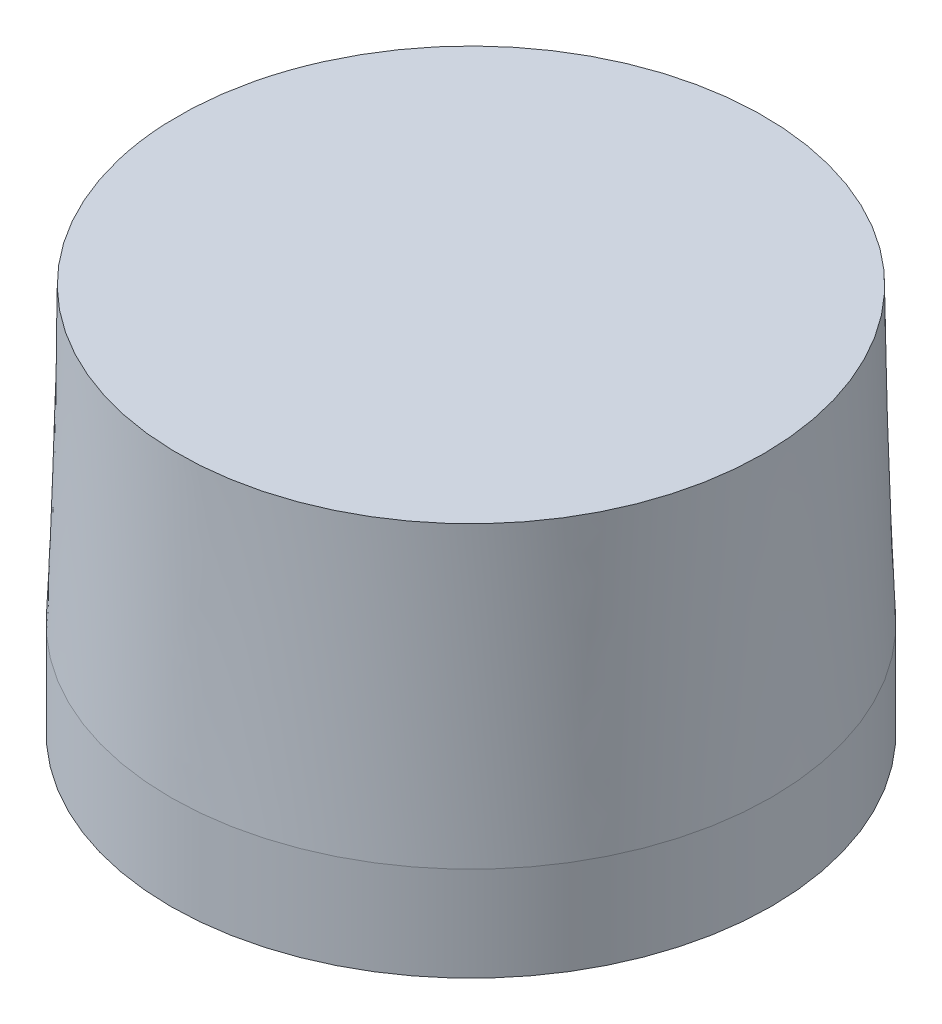
ISO-10303-21;
HEADER;
FILE_DESCRIPTION(('STEP AP214'),'2;1');
FILE_NAME('part.step','',(''),(''),'','','');
FILE_SCHEMA(('AUTOMOTIVE_DESIGN { 1 0 10303 214 1 1 1 1 }'));
ENDSEC;
DATA;
#1=APPLICATION_CONTEXT('core data for automotive mechanical design processes');
#2=APPLICATION_PROTOCOL_DEFINITION('international standard','automotive_design',2000,#1);
#3=PRODUCT_CONTEXT('',#1,'mechanical');
#4=PRODUCT('Part','Part','',(#3));
#5=PRODUCT_RELATED_PRODUCT_CATEGORY('part','',(#4));
#6=PRODUCT_DEFINITION_FORMATION('','',#4);
#7=PRODUCT_DEFINITION_CONTEXT('part definition',#1,'design');
#8=PRODUCT_DEFINITION('design','',#6,#7);
#9=PRODUCT_DEFINITION_SHAPE('','',#8);
#10=(LENGTH_UNIT() NAMED_UNIT(*) SI_UNIT(.MILLI.,.METRE.));
#11=(NAMED_UNIT(*) PLANE_ANGLE_UNIT() SI_UNIT($,.RADIAN.));
#12=(NAMED_UNIT(*) SI_UNIT($,.STERADIAN.) SOLID_ANGLE_UNIT());
#13=UNCERTAINTY_MEASURE_WITH_UNIT(LENGTH_MEASURE(1.E-05),#10,'distance_accuracy_value','');
#14=(GEOMETRIC_REPRESENTATION_CONTEXT(3) GLOBAL_UNCERTAINTY_ASSIGNED_CONTEXT((#13)) GLOBAL_UNIT_ASSIGNED_CONTEXT((#10,
#11,#12)) REPRESENTATION_CONTEXT('',''));
#15=CARTESIAN_POINT('',(0.,0.,0.));
#16=DIRECTION('',(0.,0.,1.));
#17=DIRECTION('',(1.,0.,0.));
#18=AXIS2_PLACEMENT_3D('',#15,#16,#17);
#19=CARTESIAN_POINT('',(14.65,4.25,-13.0304146727757));
#20=DIRECTION('',(0.,0.,1.));
#21=DIRECTION('',(1.,0.,0.));
#22=AXIS2_PLACEMENT_3D('',#19,#20,#21);
#23=PLANE('',#22);
#24=DIRECTION('',(-1.,0.,0.));
#25=VECTOR('',#24,1.);
#26=CARTESIAN_POINT('',(15.9,16.6339286852365,-13.0304146727757));
#27=LINE('',#26,#25);
#28=CARTESIAN_POINT('',(14.65,16.6339286852365,-13.0304146727757));
#29=VERTEX_POINT('',#28);
#30=CARTESIAN_POINT('',(13.9,16.6339286852365,-13.0304146727757));
#31=VERTEX_POINT('',#30);
#32=EDGE_CURVE('E150',#29,#31,#27,.T.);
#33=ORIENTED_EDGE('',*,*,#32,.T.);
#34=DIRECTION('',(0.,1.,0.));
#35=VECTOR('',#34,1.);
#36=CARTESIAN_POINT('',(13.9,4.25,-13.0304146727757));
#37=LINE('',#36,#35);
#38=CARTESIAN_POINT('',(13.9,4.25,-13.0304146727757));
#39=VERTEX_POINT('',#38);
#40=EDGE_CURVE('E183',#39,#31,#37,.T.);
#41=ORIENTED_EDGE('',*,*,#40,.F.);
#42=DIRECTION('',(1.,0.,0.));
#43=VECTOR('',#42,1.);
#44=CARTESIAN_POINT('',(14.65,4.25,-13.0304146727757));
#45=LINE('',#44,#43);
#46=CARTESIAN_POINT('',(14.65,4.25,-13.0304146727757));
#47=VERTEX_POINT('',#46);
#48=EDGE_CURVE('E167',#39,#47,#45,.T.);
#49=ORIENTED_EDGE('',*,*,#48,.T.);
#50=DIRECTION('',(0.,1.,0.));
#51=VECTOR('',#50,1.);
#52=CARTESIAN_POINT('',(14.65,4.25,-13.0304146727757));
#53=LINE('',#52,#51);
#54=EDGE_CURVE('E186',#47,#29,#53,.T.);
#55=ORIENTED_EDGE('',*,*,#54,.T.);
#56=EDGE_LOOP('',(#33,#41,#49,#55));
#57=FACE_BOUND('',#56,.T.);
#58=ADVANCED_FACE('F37',(#57),#23,.T.);
#59=CARTESIAN_POINT('',(0.,33.,0.));
#60=DIRECTION('',(0.,-1.,0.));
#61=DIRECTION('',(0.,0.,-1.));
#62=AXIS2_PLACEMENT_3D('',#59,#60,#61);
#63=CYLINDRICAL_SURFACE('',#62,26.9);
#64=DIRECTION('',(0.,1.,0.));
#65=VECTOR('',#64,1.);
#66=CARTESIAN_POINT('',(14.65,4.25,-22.5607513172767));
#67=LINE('',#66,#65);
#68=CARTESIAN_POINT('',(14.65,4.25,-22.5607513172767));
#69=VERTEX_POINT('',#68);
#70=CARTESIAN_POINT('',(14.65,32.25,-22.5607513172767));
#71=VERTEX_POINT('',#70);
#72=EDGE_CURVE('E60',#69,#71,#67,.T.);
#73=ORIENTED_EDGE('',*,*,#72,.F.);
#74=CARTESIAN_POINT('',(0.,4.25,0.));
#75=DIRECTION('',(0.,1.,0.));
#76=DIRECTION('',(0.,0.,1.));
#77=AXIS2_PLACEMENT_3D('',#74,#75,#76);
#78=CIRCLE('',#77,26.9);
#79=CARTESIAN_POINT('',(13.9,4.25,-23.0304146727757));
#80=VERTEX_POINT('',#79);
#81=EDGE_CURVE('E161',#69,#80,#78,.T.);
#82=ORIENTED_EDGE('',*,*,#81,.T.);
#83=DIRECTION('',(0.,1.,0.));
#84=VECTOR('',#83,1.);
#85=CARTESIAN_POINT('',(13.9,4.25,-23.0304146727757));
#86=LINE('',#85,#84);
#87=CARTESIAN_POINT('',(13.9,32.25,-23.0304146727757));
#88=VERTEX_POINT('',#87);
#89=EDGE_CURVE('E173',#80,#88,#86,.T.);
#90=ORIENTED_EDGE('',*,*,#89,.T.);
#91=CARTESIAN_POINT('',(0.,32.25,0.));
#92=DIRECTION('',(0.,-1.,0.));
#93=DIRECTION('',(0.,0.,-1.));
#94=AXIS2_PLACEMENT_3D('',#91,#92,#93);
#95=CIRCLE('',#94,26.9);
#96=CARTESIAN_POINT('',(13.9,32.25,23.0304146727757));
#97=VERTEX_POINT('',#96);
#98=EDGE_CURVE('E218',#97,#88,#95,.T.);
#99=ORIENTED_EDGE('',*,*,#98,.F.);
#100=DIRECTION('',(0.,1.,0.));
#101=VECTOR('',#100,1.);
#102=CARTESIAN_POINT('',(13.9,4.25,23.0304146727757));
#103=LINE('',#102,#101);
#104=CARTESIAN_POINT('',(13.9,4.25,23.0304146727757));
#105=VERTEX_POINT('',#104);
#106=EDGE_CURVE('E215',#105,#97,#103,.T.);
#107=ORIENTED_EDGE('',*,*,#106,.F.);
#108=CARTESIAN_POINT('',(0.,4.25,0.));
#109=DIRECTION('',(0.,-1.,0.));
#110=DIRECTION('',(0.,0.,-1.));
#111=AXIS2_PLACEMENT_3D('',#108,#109,#110);
#112=CIRCLE('',#111,26.9);
#113=CARTESIAN_POINT('',(14.65,4.25,22.5607513172767));
#114=VERTEX_POINT('',#113);
#115=EDGE_CURVE('E191',#114,#105,#112,.T.);
#116=ORIENTED_EDGE('',*,*,#115,.F.);
#117=DIRECTION('',(0.,1.,0.));
#118=VECTOR('',#117,1.);
#119=CARTESIAN_POINT('',(14.65,4.25,22.5607513172767));
#120=LINE('',#119,#118);
#121=CARTESIAN_POINT('',(14.65,32.25,22.5607513172767));
#122=VERTEX_POINT('',#121);
#123=EDGE_CURVE('E201',#114,#122,#120,.T.);
#124=ORIENTED_EDGE('',*,*,#123,.T.);
#125=EDGE_CURVE('E217',#71,#122,#95,.T.);
#126=ORIENTED_EDGE('',*,*,#125,.F.);
#127=EDGE_LOOP('',(#73,#82,#90,#99,#107,#116,#124,#126));
#128=FACE_BOUND('',#127,.T.);
#129=CARTESIAN_POINT('',(0.,0.,0.));
#130=DIRECTION('',(0.,1.,0.));
#131=DIRECTION('',(0.,0.,1.));
#132=AXIS2_PLACEMENT_3D('',#129,#130,#131);
#133=CIRCLE('',#132,26.9);
#134=CARTESIAN_POINT('',(0.,0.,26.9));
#135=VERTEX_POINT('',#134);
#136=EDGE_CURVE('E45',#135,#135,#133,.T.);
#137=ORIENTED_EDGE('',*,*,#136,.F.);
#138=EDGE_LOOP('',(#137));
#139=FACE_BOUND('',#138,.T.);
#140=ADVANCED_FACE('F39',(#128,#139),#63,.F.);
#141=CARTESIAN_POINT('',(0.,32.25,0.));
#142=DIRECTION('',(0.,-1.,0.));
#143=DIRECTION('',(0.,0.,-1.));
#144=AXIS2_PLACEMENT_3D('',#141,#142,#143);
#145=PLANE('',#144);
#146=DIRECTION('',(0.,0.,-1.));
#147=VECTOR('',#146,1.);
#148=CARTESIAN_POINT('',(14.65,32.25,-22.5607513172767));
#149=LINE('',#148,#147);
#150=CARTESIAN_POINT('',(14.65,32.25,-13.0304146727757));
#151=VERTEX_POINT('',#150);
#152=EDGE_CURVE('E160',#151,#71,#149,.T.);
#153=ORIENTED_EDGE('',*,*,#152,.T.);
#154=ORIENTED_EDGE('',*,*,#125,.T.);
#155=DIRECTION('',(0.,0.,1.));
#156=VECTOR('',#155,1.);
#157=CARTESIAN_POINT('',(14.65,32.25,22.5607513172767));
#158=LINE('',#157,#156);
#159=CARTESIAN_POINT('',(14.65,32.25,13.0304146727757));
#160=VERTEX_POINT('',#159);
#161=EDGE_CURVE('E195',#160,#122,#158,.T.);
#162=ORIENTED_EDGE('',*,*,#161,.F.);
#163=DIRECTION('',(1.,0.,0.));
#164=VECTOR('',#163,1.);
#165=CARTESIAN_POINT('',(14.65,32.25,13.0304146727757));
#166=LINE('',#165,#164);
#167=CARTESIAN_POINT('',(13.9,32.25,13.0304146727757));
#168=VERTEX_POINT('',#167);
#169=EDGE_CURVE('E203',#168,#160,#166,.T.);
#170=ORIENTED_EDGE('',*,*,#169,.F.);
#171=DIRECTION('',(0.,0.,-1.));
#172=VECTOR('',#171,1.);
#173=CARTESIAN_POINT('',(13.9,32.25,13.0304146727757));
#174=LINE('',#173,#172);
#175=EDGE_CURVE('E190',#97,#168,#174,.T.);
#176=ORIENTED_EDGE('',*,*,#175,.F.);
#177=ORIENTED_EDGE('',*,*,#98,.T.);
#178=DIRECTION('',(0.,0.,1.));
#179=VECTOR('',#178,1.);
#180=CARTESIAN_POINT('',(13.9,32.25,-13.0304146727757));
#181=LINE('',#180,#179);
#182=CARTESIAN_POINT('',(13.9,32.25,-13.0304146727757));
#183=VERTEX_POINT('',#182);
#184=EDGE_CURVE('E164',#88,#183,#181,.T.);
#185=ORIENTED_EDGE('',*,*,#184,.T.);
#186=DIRECTION('',(1.,0.,0.));
#187=VECTOR('',#186,1.);
#188=CARTESIAN_POINT('',(14.65,32.25,-13.0304146727757));
#189=LINE('',#188,#187);
#190=EDGE_CURVE('E175',#183,#151,#189,.T.);
#191=ORIENTED_EDGE('',*,*,#190,.T.);
#192=EDGE_LOOP('',(#153,#154,#162,#170,#176,#177,#185,#191));
#193=FACE_BOUND('',#192,.T.);
#194=ADVANCED_FACE('F238',(#193),#145,.T.);
#195=CARTESIAN_POINT('',(0.,0.,0.));
#196=DIRECTION('',(0.,1.,0.));
#197=DIRECTION('',(0.,0.,1.));
#198=AXIS2_PLACEMENT_3D('',#195,#196,#197);
#199=PLANE('',#198);
#200=ORIENTED_EDGE('',*,*,#136,.T.);
#201=EDGE_LOOP('',(#200));
#202=FACE_BOUND('',#201,.T.);
#203=CARTESIAN_POINT('',(0.,0.,0.));
#204=DIRECTION('',(0.,1.,0.));
#205=DIRECTION('',(0.,0.,1.));
#206=AXIS2_PLACEMENT_3D('',#203,#204,#205);
#207=CIRCLE('',#206,27.9);
#208=CARTESIAN_POINT('',(0.,0.,27.9));
#209=VERTEX_POINT('',#208);
#210=EDGE_CURVE('E12',#209,#209,#207,.T.);
#211=ORIENTED_EDGE('',*,*,#210,.F.);
#212=EDGE_LOOP('',(#211));
#213=FACE_BOUND('',#212,.T.);
#214=ADVANCED_FACE('F234',(#202,#213),#199,.F.);
#215=CARTESIAN_POINT('',(0.,5.,0.));
#216=DIRECTION('',(0.,-1.,0.));
#217=DIRECTION('',(0.,0.,-1.));
#218=AXIS2_PLACEMENT_3D('',#215,#216,#217);
#219=CYLINDRICAL_SURFACE('',#218,28.65);
#220=CARTESIAN_POINT('',(0.,5.,0.));
#221=DIRECTION('',(0.,1.,0.));
#222=DIRECTION('',(0.,0.,1.));
#223=AXIS2_PLACEMENT_3D('',#220,#221,#222);
#224=CIRCLE('',#223,28.65);
#225=CARTESIAN_POINT('',(27.571898019697,5.,7.78543123991395));
#226=VERTEX_POINT('',#225);
#227=EDGE_CURVE('E229',#226,#226,#224,.T.);
#228=ORIENTED_EDGE('',*,*,#227,.F.);
#229=EDGE_LOOP('',(#228));
#230=FACE_BOUND('',#229,.T.);
#231=CARTESIAN_POINT('',(0.,-4.,0.));
#232=DIRECTION('',(0.,1.,0.));
#233=DIRECTION('',(0.,0.,1.));
#234=AXIS2_PLACEMENT_3D('',#231,#232,#233);
#235=CIRCLE('',#234,28.65);
#236=CARTESIAN_POINT('',(0.,-4.,28.65));
#237=VERTEX_POINT('',#236);
#238=EDGE_CURVE('E226',#237,#237,#235,.T.);
#239=ORIENTED_EDGE('',*,*,#238,.T.);
#240=EDGE_LOOP('',(#239));
#241=FACE_BOUND('',#240,.T.);
#242=ADVANCED_FACE('F425',(#230,#241),#219,.T.);
#243=CARTESIAN_POINT('',(0.,-4.,0.));
#244=DIRECTION('',(0.,1.,0.));
#245=DIRECTION('',(0.,0.,1.));
#246=AXIS2_PLACEMENT_3D('',#243,#244,#245);
#247=CYLINDRICAL_SURFACE('',#246,27.9);
#248=CARTESIAN_POINT('',(0.,-4.,0.));
#249=DIRECTION('',(0.,1.,0.));
#250=DIRECTION('',(0.,0.,1.));
#251=AXIS2_PLACEMENT_3D('',#248,#249,#250);
#252=CIRCLE('',#251,27.9);
#253=CARTESIAN_POINT('',(0.,-4.,27.9));
#254=VERTEX_POINT('',#253);
#255=EDGE_CURVE('E223',#254,#254,#252,.T.);
#256=ORIENTED_EDGE('',*,*,#255,.F.);
#257=EDGE_LOOP('',(#256));
#258=FACE_BOUND('',#257,.T.);
#259=ORIENTED_EDGE('',*,*,#210,.T.);
#260=EDGE_LOOP('',(#259));
#261=FACE_BOUND('',#260,.T.);
#262=ADVANCED_FACE('F414',(#258,#261),#247,.F.);
#263=CARTESIAN_POINT('',(0.,-4.,0.));
#264=DIRECTION('',(0.,1.,0.));
#265=DIRECTION('',(0.,0.,1.));
#266=AXIS2_PLACEMENT_3D('',#263,#264,#265);
#267=PLANE('',#266);
#268=ORIENTED_EDGE('',*,*,#255,.T.);
#269=EDGE_LOOP('',(#268));
#270=FACE_BOUND('',#269,.T.);
#271=ORIENTED_EDGE('',*,*,#238,.F.);
#272=EDGE_LOOP('',(#271));
#273=FACE_BOUND('',#272,.T.);
#274=ADVANCED_FACE('F403',(#270,#273),#267,.F.);
#275=CARTESIAN_POINT('',(27.7794563342098,33.,2.59071530194459));
#276=CARTESIAN_POINT('',(27.571898019697,5.,7.78543123991395));
#277=CARTESIAN_POINT('',(22.5980257303206,33.,58.1496279703642));
#278=CARTESIAN_POINT('',(12.0010355398691,5.,62.929227279308));
#279=CARTESIAN_POINT('',(-32.960886938099,33.,52.968197366475));
#280=CARTESIAN_POINT('',(-43.1427604995249,5.,47.3583647994801));
#281=CARTESIAN_POINT('',(-27.7794563342098,33.,-2.59071530194459));
#282=CARTESIAN_POINT('',(-27.571898019697,5.,-7.78543123991395));
#283=CARTESIAN_POINT('',(-22.5980257303206,33.,-58.1496279703642));
#284=CARTESIAN_POINT('',(-12.0010355398691,5.,-62.9292272793079));
#285=CARTESIAN_POINT('',(32.960886938099,33.,-52.9681973664751));
#286=CARTESIAN_POINT('',(43.1427604995249,5.,-47.35836479948));
#287=CARTESIAN_POINT('',(27.7794563342098,33.,2.59071530194459));
#288=CARTESIAN_POINT('',(27.571898019697,5.,7.78543123991395));
#289=(BOUNDED_SURFACE() B_SPLINE_SURFACE(3,1,((#275,#276),(#277,#278),(#279,#280),(#281,#282),
(#283,#284),(#285,#286),(#287,#288)),.UNSPECIFIED.,.T.,.F.,.F.) B_SPLINE_SURFACE_WITH_KNOTS((4,
3,4),(2,2),(0.,0.5,1.),(0.,1.),
.UNSPECIFIED.) GEOMETRIC_REPRESENTATION_ITEM() RATIONAL_B_SPLINE_SURFACE(((1.,1.),
(0.333333333333333,0.333333333333333),(0.333333333333333,0.333333333333333),(1.,1.),
(0.333333333333333,0.333333333333334),(0.333333333333333,0.333333333333334),(1.,1.))) REPRESENTATION_ITEM('') SURFACE());
#290=CARTESIAN_POINT('',(0.,33.,0.));
#291=DIRECTION('',(0.,1.,0.));
#292=DIRECTION('',(0.,0.,1.));
#293=AXIS2_PLACEMENT_3D('',#290,#291,#292);
#294=CIRCLE('',#293,27.9);
#295=CARTESIAN_POINT('',(27.7794563342098,33.,2.59071530194459));
#296=VERTEX_POINT('',#295);
#297=EDGE_CURVE('E220',#296,#296,#294,.T.);
#298=CARTESIAN_POINT('',(27.7794563342098,33.,2.59071530194459));
#299=CARTESIAN_POINT('',(27.7772942684336,32.7083333333333,2.64482692629843));
#300=CARTESIAN_POINT('',(27.7751322026575,32.4166666666667,2.69893855065228));
#301=CARTESIAN_POINT('',(27.7708080711051,31.8333333333333,2.80716179935998));
#302=CARTESIAN_POINT('',(27.7686460053289,31.5416666666667,2.86127342371382));
#303=CARTESIAN_POINT('',(27.7643218737766,30.9583333333333,2.96949667242152));
#304=CARTESIAN_POINT('',(27.7621598080004,30.6666666666667,3.02360829677537));
#305=CARTESIAN_POINT('',(27.7578356764481,30.0833333333333,3.13183154548306));
#306=CARTESIAN_POINT('',(27.7556736106719,29.7916666666667,3.18594316983691));
#307=CARTESIAN_POINT('',(27.7513494791195,29.2083333333333,3.2941664185446));
#308=CARTESIAN_POINT('',(27.7491874133434,28.9166666666667,3.34827804289845));
#309=CARTESIAN_POINT('',(27.744863281791,28.3333333333333,3.45650129160615));
#310=CARTESIAN_POINT('',(27.7427012160148,28.0416666666667,3.51061291595999));
#311=CARTESIAN_POINT('',(27.7383770844625,27.4583333333333,3.61883616466769));
#312=CARTESIAN_POINT('',(27.7362150186863,27.1666666666667,3.67294778902154));
#313=CARTESIAN_POINT('',(27.731890887134,26.5833333333333,3.78117103772923));
#314=CARTESIAN_POINT('',(27.7297288213578,26.2916666666667,3.83528266208308));
#315=CARTESIAN_POINT('',(27.7254046898054,25.7083333333333,3.94350591079078));
#316=CARTESIAN_POINT('',(27.7232426240293,25.4166666666667,3.99761753514462));
#317=CARTESIAN_POINT('',(27.7189184924769,24.8333333333333,4.10584078385232));
#318=CARTESIAN_POINT('',(27.7167564267007,24.5416666666667,4.15995240820616));
#319=CARTESIAN_POINT('',(27.7124322951484,23.9583333333333,4.26817565691386));
#320=CARTESIAN_POINT('',(27.7102702293722,23.6666666666667,4.32228728126771));
#321=CARTESIAN_POINT('',(27.7059460978199,23.0833333333333,4.4305105299754));
#322=CARTESIAN_POINT('',(27.7037840320437,22.7916666666667,4.48462215432925));
#323=CARTESIAN_POINT('',(27.6994599004913,22.2083333333333,4.59284540303694));
#324=CARTESIAN_POINT('',(27.6972978347152,21.9166666666667,4.64695702739079));
#325=CARTESIAN_POINT('',(27.6929737031628,21.3333333333333,4.75518027609849));
#326=CARTESIAN_POINT('',(27.6908116373866,21.0416666666667,4.80929190045234));
#327=CARTESIAN_POINT('',(27.6864875058343,20.4583333333333,4.91751514916003));
#328=CARTESIAN_POINT('',(27.6843254400581,20.1666666666667,4.97162677351388));
#329=CARTESIAN_POINT('',(27.6800013085058,19.5833333333333,5.07985002222157));
#330=CARTESIAN_POINT('',(27.6778392427296,19.2916666666667,5.13396164657542));
#331=CARTESIAN_POINT('',(27.6735151111772,18.7083333333333,5.24218489528312));
#332=CARTESIAN_POINT('',(27.6713530454011,18.4166666666667,5.29629651963696));
#333=CARTESIAN_POINT('',(27.6670289138487,17.8333333333333,5.40451976834466));
#334=CARTESIAN_POINT('',(27.6648668480725,17.5416666666667,5.45863139269851));
#335=CARTESIAN_POINT('',(27.6605427165202,16.9583333333333,5.5668546414062));
#336=CARTESIAN_POINT('',(27.658380650744,16.6666666666667,5.62096626576005));
#337=CARTESIAN_POINT('',(27.6540565191917,16.0833333333333,5.72918951446774));
#338=CARTESIAN_POINT('',(27.6518944534155,15.7916666666667,5.78330113882159));
#339=CARTESIAN_POINT('',(27.6475703218631,15.2083333333333,5.89152438752929));
#340=CARTESIAN_POINT('',(27.645408256087,14.9166666666667,5.94563601188313));
#341=CARTESIAN_POINT('',(27.6410841245346,14.3333333333333,6.05385926059083));
#342=CARTESIAN_POINT('',(27.6389220587584,14.0416666666667,6.10797088494468));
#343=CARTESIAN_POINT('',(27.6345979272061,13.4583333333333,6.21619413365237));
#344=CARTESIAN_POINT('',(27.6324358614299,13.1666666666667,6.27030575800622));
#345=CARTESIAN_POINT('',(27.6281117298776,12.5833333333333,6.37852900671392));
#346=CARTESIAN_POINT('',(27.6259496641014,12.2916666666667,6.43264063106776));
#347=CARTESIAN_POINT('',(27.621625532549,11.7083333333333,6.54086387977546));
#348=CARTESIAN_POINT('',(27.6194634667729,11.4166666666667,6.5949755041293));
#349=CARTESIAN_POINT('',(27.6151393352205,10.8333333333333,6.703198752837));
#350=CARTESIAN_POINT('',(27.6129772694443,10.5416666666667,6.75731037719085));
#351=CARTESIAN_POINT('',(27.608653137892,9.95833333333333,6.86553362589854));
#352=CARTESIAN_POINT('',(27.6064910721158,9.66666666666667,6.91964525025239));
#353=CARTESIAN_POINT('',(27.6021669405635,9.08333333333333,7.02786849896008));
#354=CARTESIAN_POINT('',(27.6000048747873,8.79166666666667,7.08198012331393));
#355=CARTESIAN_POINT('',(27.5956807432349,8.20833333333333,7.19020337202163));
#356=CARTESIAN_POINT('',(27.5935186774588,7.91666666666667,7.24431499637547));
#357=CARTESIAN_POINT('',(27.5891945459064,7.33333333333333,7.35253824508317));
#358=CARTESIAN_POINT('',(27.5870324801302,7.04166666666667,7.40664986943702));
#359=CARTESIAN_POINT('',(27.5827083485779,6.45833333333333,7.51487311814471));
#360=CARTESIAN_POINT('',(27.5805462828017,6.16666666666667,7.56898474249856));
#361=CARTESIAN_POINT('',(27.5762221512494,5.58333333333333,7.67720799120625));
#362=CARTESIAN_POINT('',(27.5740600854732,5.29166666666667,7.7313196155601));
#363=CARTESIAN_POINT('',(27.571898019697,5.,7.78543123991395));
#364=B_SPLINE_CURVE_WITH_KNOTS('',3,(#298,#299,#300,#301,#302,#303,#304,#305,#306,#307,#308,
#309,#310,#311,#312,#313,#314,#315,#316,#317,#318,#319,#320,#321,#322,#323,#324,#325,#326,#327,
#328,#329,#330,#331,#332,#333,#334,#335,#336,#337,#338,#339,#340,#341,#342,#343,#344,#345,#346,
#347,#348,#349,#350,#351,#352,#353,#354,#355,#356,#357,#358,#359,#360,#361,#362,#363),
.UNSPECIFIED.,.F.,.F.,(4,2,2,2,2,2,2,2,2,2,2,2,2,2,2,2,2,2,2,2,2,2,2,2,2,2,2,2,2,2,2,2,4),(0.,
0.889954876253675,1.77990975250735,2.66986462876102,3.55981950501469,4.44977438126837,
5.33972925752204,6.22968413377572,7.11963901002939,8.00959388628307,8.89954876253674,
9.78950363879041,10.6794585150441,11.5694133912978,12.4593682675514,13.3493231438051,
14.2392780200588,15.1292328963125,16.0191877725661,16.9091426488198,17.7990975250735,
18.6890524013272,19.5790072775808,20.4689621538345,21.3589170300882,22.2488719063418,
23.1388267825955,24.0287816588492,24.9187365351029,25.8086914113565,26.6986462876102,
27.5886011638639,28.4785560401176),.UNSPECIFIED.);
#365=EDGE_CURVE('BSEAM392',#296,#226,#364,.T.);
#366=ORIENTED_EDGE('',*,*,#297,.F.);
#367=ORIENTED_EDGE('',*,*,#227,.T.);
#368=ORIENTED_EDGE('',*,*,#365,.T.);
#369=ORIENTED_EDGE('',*,*,#365,.F.);
#370=EDGE_LOOP('',(#366,#368,#367,#369));
#371=FACE_BOUND('',#370,.T.);
#372=ADVANCED_FACE('F392',(#371),#289,.T.);
#373=CARTESIAN_POINT('',(0.,33.,0.));
#374=DIRECTION('',(0.,1.,0.));
#375=DIRECTION('',(0.,0.,1.));
#376=AXIS2_PLACEMENT_3D('',#373,#374,#375);
#377=PLANE('',#376);
#378=ORIENTED_EDGE('',*,*,#297,.T.);
#379=EDGE_LOOP('',(#378));
#380=FACE_BOUND('',#379,.T.);
#381=ADVANCED_FACE('F384',(#380),#377,.T.);
#382=CARTESIAN_POINT('',(13.9,4.25,13.0304146727757));
#383=DIRECTION('',(1.,0.,0.));
#384=DIRECTION('',(0.,0.,-1.));
#385=AXIS2_PLACEMENT_3D('',#382,#383,#384);
#386=PLANE('',#385);
#387=ORIENTED_EDGE('',*,*,#175,.T.);
#388=DIRECTION('',(0.,1.,0.));
#389=VECTOR('',#388,1.);
#390=CARTESIAN_POINT('',(13.9,4.25,13.0304146727757));
#391=LINE('',#390,#389);
#392=CARTESIAN_POINT('',(13.9,4.25,13.0304146727757));
#393=VERTEX_POINT('',#392);
#394=EDGE_CURVE('E212',#393,#168,#391,.T.);
#395=ORIENTED_EDGE('',*,*,#394,.F.);
#396=DIRECTION('',(0.,0.,-1.));
#397=VECTOR('',#396,1.);
#398=CARTESIAN_POINT('',(13.9,4.25,13.0304146727757));
#399=LINE('',#398,#397);
#400=EDGE_CURVE('E194',#105,#393,#399,.T.);
#401=ORIENTED_EDGE('',*,*,#400,.F.);
#402=ORIENTED_EDGE('',*,*,#106,.T.);
#403=EDGE_LOOP('',(#387,#395,#401,#402));
#404=FACE_BOUND('',#403,.T.);
#405=ADVANCED_FACE('F282',(#404),#386,.F.);
#406=CARTESIAN_POINT('',(14.65,4.25,13.0304146727757));
#407=DIRECTION('',(0.,0.,1.));
#408=DIRECTION('',(1.,0.,0.));
#409=AXIS2_PLACEMENT_3D('',#406,#407,#408);
#410=PLANE('',#409);
#411=ORIENTED_EDGE('',*,*,#169,.T.);
#412=DIRECTION('',(0.,1.,0.));
#413=VECTOR('',#412,1.);
#414=CARTESIAN_POINT('',(14.65,4.25,13.0304146727757));
#415=LINE('',#414,#413);
#416=CARTESIAN_POINT('',(14.65,4.25,13.0304146727757));
#417=VERTEX_POINT('',#416);
#418=EDGE_CURVE('E210',#417,#160,#415,.T.);
#419=ORIENTED_EDGE('',*,*,#418,.F.);
#420=DIRECTION('',(1.,0.,0.));
#421=VECTOR('',#420,1.);
#422=CARTESIAN_POINT('',(14.65,4.25,13.0304146727757));
#423=LINE('',#422,#421);
#424=EDGE_CURVE('E197',#393,#417,#423,.T.);
#425=ORIENTED_EDGE('',*,*,#424,.F.);
#426=ORIENTED_EDGE('',*,*,#394,.T.);
#427=EDGE_LOOP('',(#411,#419,#425,#426));
#428=FACE_BOUND('',#427,.T.);
#429=ADVANCED_FACE('F278',(#428),#410,.F.);
#430=CARTESIAN_POINT('',(14.65,4.25,22.5607513172767));
#431=DIRECTION('',(-1.,0.,0.));
#432=DIRECTION('',(0.,0.,1.));
#433=AXIS2_PLACEMENT_3D('',#430,#431,#432);
#434=PLANE('',#433);
#435=ORIENTED_EDGE('',*,*,#161,.T.);
#436=ORIENTED_EDGE('',*,*,#123,.F.);
#437=DIRECTION('',(0.,0.,1.));
#438=VECTOR('',#437,1.);
#439=CARTESIAN_POINT('',(14.65,4.25,22.5607513172767));
#440=LINE('',#439,#438);
#441=EDGE_CURVE('E199',#417,#114,#440,.T.);
#442=ORIENTED_EDGE('',*,*,#441,.F.);
#443=ORIENTED_EDGE('',*,*,#418,.T.);
#444=EDGE_LOOP('',(#435,#436,#442,#443));
#445=FACE_BOUND('',#444,.T.);
#446=ADVANCED_FACE('F272',(#445),#434,.F.);
#447=CARTESIAN_POINT('',(0.,4.25,0.));
#448=DIRECTION('',(0.,-1.,0.));
#449=DIRECTION('',(0.,0.,-1.));
#450=AXIS2_PLACEMENT_3D('',#447,#448,#449);
#451=PLANE('',#450);
#452=ORIENTED_EDGE('',*,*,#115,.T.);
#453=ORIENTED_EDGE('',*,*,#400,.T.);
#454=ORIENTED_EDGE('',*,*,#424,.T.);
#455=ORIENTED_EDGE('',*,*,#441,.T.);
#456=EDGE_LOOP('',(#452,#453,#454,#455));
#457=FACE_BOUND('',#456,.T.);
#458=ADVANCED_FACE('F260',(#457),#451,.T.);
#459=CARTESIAN_POINT('',(14.65,4.25,-22.5607513172767));
#460=DIRECTION('',(1.,0.,0.));
#461=DIRECTION('',(0.,0.,-1.));
#462=AXIS2_PLACEMENT_3D('',#459,#460,#461);
#463=PLANE('',#462);
#464=DIRECTION('',(0.,0.,-1.));
#465=VECTOR('',#464,1.);
#466=CARTESIAN_POINT('',(14.65,16.6339286852365,-22.5607513172767));
#467=LINE('',#466,#465);
#468=CARTESIAN_POINT('',(14.65,16.6339286852365,-14.9001627742714));
#469=VERTEX_POINT('',#468);
#470=EDGE_CURVE('E158',#29,#469,#467,.T.);
#471=ORIENTED_EDGE('',*,*,#470,.F.);
#472=ORIENTED_EDGE('',*,*,#54,.F.);
#473=DIRECTION('',(0.,0.,-1.));
#474=VECTOR('',#473,1.);
#475=CARTESIAN_POINT('',(14.65,4.25,-22.5607513172767));
#476=LINE('',#475,#474);
#477=EDGE_CURVE('E163',#47,#69,#476,.T.);
#478=ORIENTED_EDGE('',*,*,#477,.T.);
#479=ORIENTED_EDGE('',*,*,#72,.T.);
#480=ORIENTED_EDGE('',*,*,#152,.F.);
#481=CARTESIAN_POINT('',(14.65,20.1339286852365,-13.0304146727757));
#482=VERTEX_POINT('',#481);
#483=EDGE_CURVE('E185',#482,#151,#53,.T.);
#484=ORIENTED_EDGE('',*,*,#483,.F.);
#485=DIRECTION('',(0.,0.,1.));
#486=VECTOR('',#485,1.);
#487=CARTESIAN_POINT('',(14.65,20.1339286852365,-22.5607513172767));
#488=LINE('',#487,#486);
#489=CARTESIAN_POINT('',(14.65,20.1339286852365,-14.9001627742714));
#490=VERTEX_POINT('',#489);
#491=EDGE_CURVE('E153',#490,#482,#488,.T.);
#492=ORIENTED_EDGE('',*,*,#491,.F.);
#493=CARTESIAN_POINT('',(14.65,18.3839286852365,-14.9001627742714));
#494=DIRECTION('',(1.,0.,0.));
#495=DIRECTION('',(0.,0.,-1.));
#496=AXIS2_PLACEMENT_3D('',#493,#494,#495);
#497=CIRCLE('',#496,1.75);
#498=EDGE_CURVE('E135',#469,#490,#497,.T.);
#499=ORIENTED_EDGE('',*,*,#498,.F.);
#500=EDGE_LOOP('',(#471,#472,#478,#479,#480,#484,#492,#499));
#501=FACE_BOUND('',#500,.T.);
#502=ADVANCED_FACE('F253',(#501),#463,.T.);
#503=DIRECTION('',(-1.,0.,0.));
#504=VECTOR('',#503,1.);
#505=CARTESIAN_POINT('',(15.9,20.1339286852365,-13.0304146727757));
#506=LINE('',#505,#504);
#507=CARTESIAN_POINT('',(13.9,20.1339286852365,-13.0304146727757));
#508=VERTEX_POINT('',#507);
#509=EDGE_CURVE('E52',#482,#508,#506,.T.);
#510=ORIENTED_EDGE('',*,*,#509,.F.);
#511=ORIENTED_EDGE('',*,*,#483,.T.);
#512=ORIENTED_EDGE('',*,*,#190,.F.);
#513=EDGE_CURVE('E182',#508,#183,#37,.T.);
#514=ORIENTED_EDGE('',*,*,#513,.F.);
#515=EDGE_LOOP('',(#510,#511,#512,#514));
#516=FACE_BOUND('',#515,.T.);
#517=ADVANCED_FACE('F247',(#516),#23,.T.);
#518=CARTESIAN_POINT('',(13.9,4.25,-13.0304146727757));
#519=DIRECTION('',(-1.,0.,0.));
#520=DIRECTION('',(0.,0.,1.));
#521=AXIS2_PLACEMENT_3D('',#518,#519,#520);
#522=PLANE('',#521);
#523=DIRECTION('',(0.,0.,1.));
#524=VECTOR('',#523,1.);
#525=CARTESIAN_POINT('',(13.9,16.6339286852365,-13.0304146727757));
#526=LINE('',#525,#524);
#527=CARTESIAN_POINT('',(13.9,16.6339286852365,-14.9001627742714));
#528=VERTEX_POINT('',#527);
#529=EDGE_CURVE('E146',#528,#31,#526,.T.);
#530=ORIENTED_EDGE('',*,*,#529,.F.);
#531=CARTESIAN_POINT('',(13.9,18.3839286852365,-14.9001627742714));
#532=DIRECTION('',(-1.,0.,0.));
#533=DIRECTION('',(0.,0.,1.));
#534=AXIS2_PLACEMENT_3D('',#531,#532,#533);
#535=CIRCLE('',#534,1.75);
#536=CARTESIAN_POINT('',(13.9,20.1339286852365,-14.9001627742714));
#537=VERTEX_POINT('',#536);
#538=EDGE_CURVE('E132',#537,#528,#535,.T.);
#539=ORIENTED_EDGE('',*,*,#538,.F.);
#540=DIRECTION('',(0.,0.,-1.));
#541=VECTOR('',#540,1.);
#542=CARTESIAN_POINT('',(13.9,20.1339286852365,-13.0304146727757));
#543=LINE('',#542,#541);
#544=EDGE_CURVE('E139',#508,#537,#543,.T.);
#545=ORIENTED_EDGE('',*,*,#544,.F.);
#546=ORIENTED_EDGE('',*,*,#513,.T.);
#547=ORIENTED_EDGE('',*,*,#184,.F.);
#548=ORIENTED_EDGE('',*,*,#89,.F.);
#549=DIRECTION('',(0.,0.,1.));
#550=VECTOR('',#549,1.);
#551=CARTESIAN_POINT('',(13.9,4.25,-13.0304146727757));
#552=LINE('',#551,#550);
#553=EDGE_CURVE('E170',#80,#39,#552,.T.);
#554=ORIENTED_EDGE('',*,*,#553,.T.);
#555=ORIENTED_EDGE('',*,*,#40,.T.);
#556=EDGE_LOOP('',(#530,#539,#545,#546,#547,#548,#554,#555));
#557=FACE_BOUND('',#556,.T.);
#558=ADVANCED_FACE('F144',(#557),#522,.T.);
#559=CARTESIAN_POINT('',(0.,4.25,0.));
#560=DIRECTION('',(0.,-1.,0.));
#561=DIRECTION('',(0.,0.,1.));
#562=AXIS2_PLACEMENT_3D('',#559,#560,#561);
#563=PLANE('',#562);
#564=ORIENTED_EDGE('',*,*,#81,.F.);
#565=ORIENTED_EDGE('',*,*,#477,.F.);
#566=ORIENTED_EDGE('',*,*,#48,.F.);
#567=ORIENTED_EDGE('',*,*,#553,.F.);
#568=EDGE_LOOP('',(#564,#565,#566,#567));
#569=FACE_BOUND('',#568,.T.);
#570=ADVANCED_FACE('F259',(#569),#563,.T.);
#571=CARTESIAN_POINT('',(15.9,16.6339286852365,-13.0304146727757));
#572=DIRECTION('',(0.,-1.,0.));
#573=DIRECTION('',(0.,0.,-1.));
#574=AXIS2_PLACEMENT_3D('',#571,#572,#573);
#575=PLANE('',#574);
#576=ORIENTED_EDGE('',*,*,#470,.T.);
#577=DIRECTION('',(-1.,0.,0.));
#578=VECTOR('',#577,1.);
#579=CARTESIAN_POINT('',(15.9,16.6339286852365,-14.9001627742714));
#580=LINE('',#579,#578);
#581=EDGE_CURVE('E137',#469,#528,#580,.T.);
#582=ORIENTED_EDGE('',*,*,#581,.T.);
#583=ORIENTED_EDGE('',*,*,#529,.T.);
#584=ORIENTED_EDGE('',*,*,#32,.F.);
#585=EDGE_LOOP('',(#576,#582,#583,#584));
#586=FACE_BOUND('',#585,.T.);
#587=ADVANCED_FACE('F290',(#586),#575,.F.);
#588=CARTESIAN_POINT('',(15.9,18.3839286852365,-14.9001627742714));
#589=DIRECTION('',(-1.,0.,0.));
#590=DIRECTION('',(0.,0.,1.));
#591=AXIS2_PLACEMENT_3D('',#588,#589,#590);
#592=CYLINDRICAL_SURFACE('',#591,1.75);
#593=ORIENTED_EDGE('',*,*,#498,.T.);
#594=DIRECTION('',(-1.,0.,0.));
#595=VECTOR('',#594,1.);
#596=CARTESIAN_POINT('',(15.9,20.1339286852365,-14.9001627742714));
#597=LINE('',#596,#595);
#598=EDGE_CURVE('E128',#490,#537,#597,.T.);
#599=ORIENTED_EDGE('',*,*,#598,.T.);
#600=ORIENTED_EDGE('',*,*,#538,.T.);
#601=ORIENTED_EDGE('',*,*,#581,.F.);
#602=EDGE_LOOP('',(#593,#599,#600,#601));
#603=FACE_BOUND('',#602,.T.);
#604=ADVANCED_FACE('F129',(#603),#592,.F.);
#605=CARTESIAN_POINT('',(15.9,20.1339286852365,-13.0304146727757));
#606=DIRECTION('',(0.,1.,0.));
#607=DIRECTION('',(0.,0.,1.));
#608=AXIS2_PLACEMENT_3D('',#605,#606,#607);
#609=PLANE('',#608);
#610=ORIENTED_EDGE('',*,*,#491,.T.);
#611=ORIENTED_EDGE('',*,*,#509,.T.);
#612=ORIENTED_EDGE('',*,*,#544,.T.);
#613=ORIENTED_EDGE('',*,*,#598,.F.);
#614=EDGE_LOOP('',(#610,#611,#612,#613));
#615=FACE_BOUND('',#614,.T.);
#616=ADVANCED_FACE('F140',(#615),#609,.F.);
#617=CLOSED_SHELL('',(#58,#140,#194,#214,#242,#262,#274,#372,#381,#405,#429,#446,#458,#502,#517,
#558,#570,#587,#604,#616));
#618=MANIFOLD_SOLID_BREP('B2',#617);
#619=ADVANCED_BREP_SHAPE_REPRESENTATION('',(#18,#618),#14);
#620=SHAPE_DEFINITION_REPRESENTATION(#9,#619);
ENDSEC;
END-ISO-10303-21;
